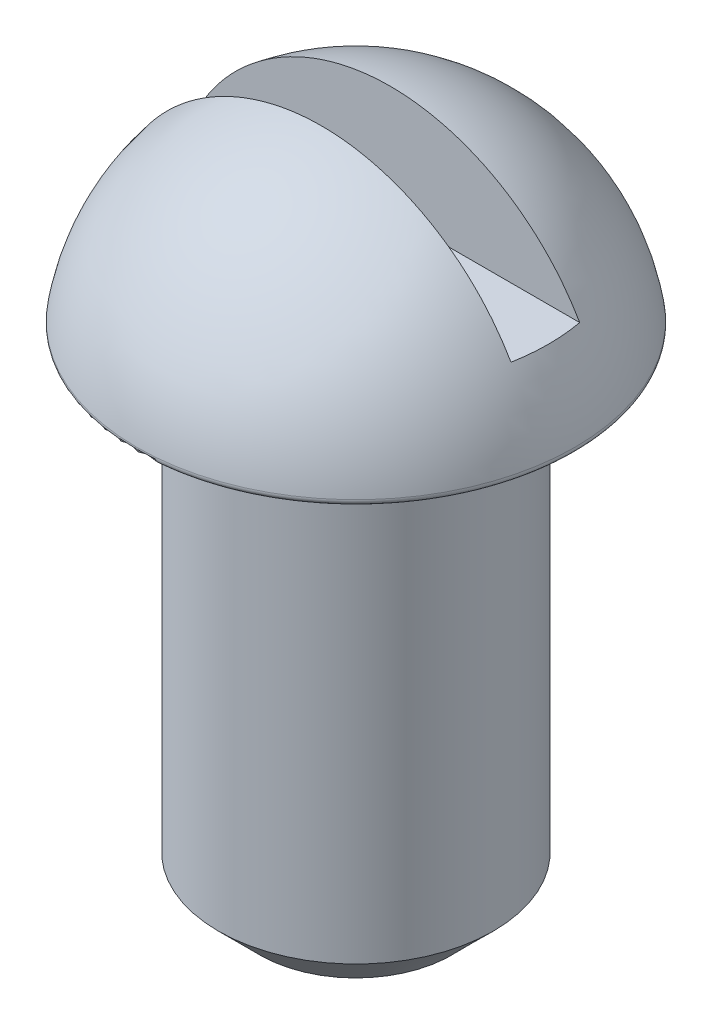
ISO-10303-21;
HEADER;
FILE_DESCRIPTION(('STEP AP214'),'2;1');
FILE_NAME('part.step','',(''),(''),'','','');
FILE_SCHEMA(('AUTOMOTIVE_DESIGN { 1 0 10303 214 1 1 1 1 }'));
ENDSEC;
DATA;
#1=APPLICATION_CONTEXT('core data for automotive mechanical design processes');
#2=APPLICATION_PROTOCOL_DEFINITION('international standard','automotive_design',2000,#1);
#3=PRODUCT_CONTEXT('',#1,'mechanical');
#4=PRODUCT('Part','Part','',(#3));
#5=PRODUCT_RELATED_PRODUCT_CATEGORY('part','',(#4));
#6=PRODUCT_DEFINITION_FORMATION('','',#4);
#7=PRODUCT_DEFINITION_CONTEXT('part definition',#1,'design');
#8=PRODUCT_DEFINITION('design','',#6,#7);
#9=PRODUCT_DEFINITION_SHAPE('','',#8);
#10=(LENGTH_UNIT() NAMED_UNIT(*) SI_UNIT(.MILLI.,.METRE.));
#11=(NAMED_UNIT(*) PLANE_ANGLE_UNIT() SI_UNIT($,.RADIAN.));
#12=(NAMED_UNIT(*) SI_UNIT($,.STERADIAN.) SOLID_ANGLE_UNIT());
#13=UNCERTAINTY_MEASURE_WITH_UNIT(LENGTH_MEASURE(1.E-05),#10,'distance_accuracy_value','');
#14=(GEOMETRIC_REPRESENTATION_CONTEXT(3) GLOBAL_UNCERTAINTY_ASSIGNED_CONTEXT((#13)) GLOBAL_UNIT_ASSIGNED_CONTEXT((#10,
#11,#12)) REPRESENTATION_CONTEXT('',''));
#15=CARTESIAN_POINT('',(0.,0.,0.));
#16=DIRECTION('',(0.,0.,1.));
#17=DIRECTION('',(1.,0.,0.));
#18=AXIS2_PLACEMENT_3D('',#15,#16,#17);
#19=CARTESIAN_POINT('',(0.,86.2524408793204,0.));
#20=DIRECTION('',(0.,1.,0.));
#21=DIRECTION('',(-1.,0.,0.));
#22=AXIS2_PLACEMENT_3D('',#19,#20,#21);
#23=DEGENERATE_TOROIDAL_SURFACE('',#22,0.0384230851507465,8.1,.F.);
#24=CARTESIAN_POINT('',(0.,87.4796137035631,0.));
#25=DIRECTION('',(0.,-1.,0.));
#26=DIRECTION('',(1.,0.,0.));
#27=AXIS2_PLACEMENT_3D('',#24,#25,#26);
#28=CIRCLE('',#27,7.96807720270539);
#29=CARTESIAN_POINT('',(7.96807720270538,87.4796137035631,0.));
#30=VERTEX_POINT('',#29);
#31=EDGE_CURVE('E109',#30,#30,#28,.F.);
#32=ORIENTED_EDGE('',*,*,#31,.T.);
#33=EDGE_LOOP('',(#32));
#34=FACE_BOUND('',#33,.T.);
#35=CARTESIAN_POINT('',(0.,90.2493131400015,0.));
#36=DIRECTION('',(0.,1.,0.));
#37=DIRECTION('',(0.,0.,1.));
#38=AXIS2_PLACEMENT_3D('',#35,#36,#37);
#39=CIRCLE('',#38,7.00678891533569);
#40=CARTESIAN_POINT('',(6.89438836330468,90.2493131400015,1.25));
#41=VERTEX_POINT('',#40);
#42=CARTESIAN_POINT('',(6.89438836330468,90.2493131400015,-1.25));
#43=VERTEX_POINT('',#42);
#44=EDGE_CURVE('E59',#41,#43,#39,.T.);
#45=ORIENTED_EDGE('',*,*,#44,.F.);
#46=CARTESIAN_POINT('',(0.,94.2493131400015,1.25));
#47=CARTESIAN_POINT('',(-0.210444098656722,94.2493106182386,1.25));
#48=CARTESIAN_POINT('',(-0.420915171091449,94.240729268692,1.25));
#49=CARTESIAN_POINT('',(-0.840711628661708,94.2066117558092,1.25));
#50=CARTESIAN_POINT('',(-1.05003533347624,94.1810552342553,1.25));
#51=CARTESIAN_POINT('',(-1.46838598501902,94.1129450587525,1.25));
#52=CARTESIAN_POINT('',(-1.67738151830488,94.0701983004619,1.25));
#53=CARTESIAN_POINT('',(-2.091338821844,93.9680592621398,1.25));
#54=CARTESIAN_POINT('',(-2.2962991585412,93.9086611767682,1.25));
#55=CARTESIAN_POINT('',(-2.70102600559802,93.7735733583917,1.25));
#56=CARTESIAN_POINT('',(-2.90078665327301,93.6978660587258,1.25));
#57=CARTESIAN_POINT('',(-3.29361013679777,93.5307006837288,1.25));
#58=CARTESIAN_POINT('',(-3.48667273310611,93.4392420457811,1.25));
#59=CARTESIAN_POINT('',(-3.87430783636395,93.2362211726433,1.25));
#60=CARTESIAN_POINT('',(-4.06847468654234,93.1238833318637,1.25));
#61=CARTESIAN_POINT('',(-4.44669740779608,92.8832939361654,1.25));
#62=CARTESIAN_POINT('',(-4.63075269267263,92.7550414600275,1.25));
#63=CARTESIAN_POINT('',(-4.98738216349701,92.483583788595,1.25));
#64=CARTESIAN_POINT('',(-5.15996041210719,92.3403839310228,1.25));
#65=CARTESIAN_POINT('',(-5.49254812705547,92.0399542364659,1.25));
#66=CARTESIAN_POINT('',(-5.65255319736907,91.8827195330858,1.25));
#67=CARTESIAN_POINT('',(-5.95929728446561,91.5548415716412,1.25));
#68=CARTESIAN_POINT('',(-6.10599153988455,91.3841564341133,1.25));
#69=CARTESIAN_POINT('',(-6.3844875052174,91.0310362248629,1.25));
#70=CARTESIAN_POINT('',(-6.5162889607459,90.8486009525186,1.25));
#71=CARTESIAN_POINT('',(-6.76406381176498,90.4732749600586,1.25));
#72=CARTESIAN_POINT('',(-6.88003683344512,90.2803839931674,1.25));
#73=CARTESIAN_POINT('',(-7.09532998959396,89.8855168764467,1.25));
#74=CARTESIAN_POINT('',(-7.19464976203485,89.6835405292297,1.25));
#75=CARTESIAN_POINT('',(-7.37594240896028,89.2719091315828,1.25));
#76=CARTESIAN_POINT('',(-7.45791254895252,89.0622528768146,1.25));
#77=CARTESIAN_POINT('',(-7.60392924760568,88.6367077733086,1.25));
#78=CARTESIAN_POINT('',(-7.66796958518981,88.4208167899068,1.25));
#79=CARTESIAN_POINT('',(-7.77761357362298,87.9844871567926,1.25));
#80=CARTESIAN_POINT('',(-7.82322397850264,87.7640502042285,1.25));
#81=CARTESIAN_POINT('',(-7.89573137564736,87.3200349746625,1.25));
#82=CARTESIAN_POINT('',(-7.9226213571892,87.0964555527616,1.25));
#83=CARTESIAN_POINT('',(-7.95746335520514,86.6479007762343,1.25));
#84=CARTESIAN_POINT('',(-7.96542165942047,86.4229259099708,1.25));
#85=CARTESIAN_POINT('',(-7.9623614586539,85.9730031967501,1.25));
#86=CARTESIAN_POINT('',(-7.95133435207463,85.7480554082418,1.25));
#87=CARTESIAN_POINT('',(-7.91036515995159,85.2998886293765,1.25));
#88=CARTESIAN_POINT('',(-7.88042304824941,85.0766696414109,1.25));
#89=CARTESIAN_POINT('',(-7.80185456534035,84.6336489099564,1.25));
#90=CARTESIAN_POINT('',(-7.75323666351383,84.4138456643884,1.25));
#91=CARTESIAN_POINT('',(-7.63763651265463,83.97902255656,1.25));
#92=CARTESIAN_POINT('',(-7.57064648272357,83.7640047628254,1.25));
#93=CARTESIAN_POINT('',(-7.41881578976161,83.3404577578911,1.25));
#94=CARTESIAN_POINT('',(-7.33398181540455,83.131926148918,1.25));
#95=CARTESIAN_POINT('',(-7.14701692699296,82.7226752987604,1.25));
#96=CARTESIAN_POINT('',(-7.04487976255134,82.5219589129854,1.25));
#97=CARTESIAN_POINT('',(-6.82409429192031,82.1299142078533,1.25));
#98=CARTESIAN_POINT('',(-6.70545171799182,81.9385826602503,1.25));
#99=CARTESIAN_POINT('',(-6.45245129030857,81.5665637752387,1.25));
#100=CARTESIAN_POINT('',(-6.31809094134135,81.3858781347431,1.25));
#101=CARTESIAN_POINT('',(-6.03462822591123,81.0364734599988,1.25));
#102=CARTESIAN_POINT('',(-5.88552620568006,80.8677541448614,1.25));
#103=CARTESIAN_POINT('',(-5.57363666143652,80.5434776445529,1.25));
#104=CARTESIAN_POINT('',(-5.41084911374973,80.3879204821517,1.25));
#105=CARTESIAN_POINT('',(-5.07274806615496,80.0910785088807,1.25));
#106=CARTESIAN_POINT('',(-4.89743476617534,79.9497934702949,1.25));
#107=CARTESIAN_POINT('',(-4.53552535871413,79.6824998839393,1.25));
#108=CARTESIAN_POINT('',(-4.34892925198677,79.5564913351483,1.25));
#109=CARTESIAN_POINT('',(-3.96585072727751,79.320694471951,1.25));
#110=CARTESIAN_POINT('',(-3.76937199528264,79.2109001692757,1.25));
#111=CARTESIAN_POINT('',(-3.36779807961204,79.0082326722168,1.25));
#112=CARTESIAN_POINT('',(-3.16270030514745,78.915364611096,1.25));
#113=CARTESIAN_POINT('',(-2.74539796181873,78.7472635302768,1.25));
#114=CARTESIAN_POINT('',(-2.53319332377721,78.6720306822947,1.25));
#115=CARTESIAN_POINT('',(-2.10330425640095,78.5398002888788,1.25));
#116=CARTESIAN_POINT('',(-1.88562292632754,78.4827926694883,1.25));
#117=CARTESIAN_POINT('',(-1.44621095139965,78.3874232061252,1.25));
#118=CARTESIAN_POINT('',(-1.22448030633082,78.3490613631395,1.25));
#119=CARTESIAN_POINT('',(-0.77860911646337,78.2914144778121,1.25));
#120=CARTESIAN_POINT('',(-0.554469267185752,78.2721240716702,1.25));
#121=CARTESIAN_POINT('',(-0.105365601560897,78.2530416668801,1.25));
#122=CARTESIAN_POINT('',(0.11959817217636,78.2532486737558,1.25));
#123=CARTESIAN_POINT('',(0.565152365889479,78.2729961666142,1.25));
#124=CARTESIAN_POINT('',(0.785756296430835,78.2922352446033,1.25));
#125=CARTESIAN_POINT('',(1.22457187068004,78.3491782117958,1.25));
#126=CARTESIAN_POINT('',(1.44278340793636,78.3868829192612,1.25));
#127=CARTESIAN_POINT('',(1.87535784169964,78.4803674664853,1.25));
#128=CARTESIAN_POINT('',(2.08971970399034,78.5361520889635,1.25));
#129=CARTESIAN_POINT('',(2.51305776453362,78.6653473749476,1.25));
#130=CARTESIAN_POINT('',(2.72203407918857,78.738757657141,1.25));
#131=CARTESIAN_POINT('',(3.13444748787196,78.9031821267064,1.25));
#132=CARTESIAN_POINT('',(3.33784216472272,78.9943027204864,1.25));
#133=CARTESIAN_POINT('',(3.73638797719893,79.1932394886285,1.25));
#134=CARTESIAN_POINT('',(3.93153607799668,79.3010617424352,1.25));
#135=CARTESIAN_POINT('',(4.31209095748389,79.5325821369262,1.25));
#136=CARTESIAN_POINT('',(4.49750081061984,79.6562752240768,1.25));
#137=CARTESIAN_POINT('',(4.85735822364165,79.9187000701622,1.25));
#138=CARTESIAN_POINT('',(5.03180556856822,80.0574321238446,1.25));
#139=CARTESIAN_POINT('',(5.37009685679253,80.3503298436769,1.25));
#140=CARTESIAN_POINT('',(5.53382629585807,80.5046277893097,1.25));
#141=CARTESIAN_POINT('',(5.84771839692947,80.82646423541,1.25));
#142=CARTESIAN_POINT('',(5.99788064881993,80.9940031358445,1.25));
#143=CARTESIAN_POINT('',(6.28355229639746,81.3411083521698,1.25));
#144=CARTESIAN_POINT('',(6.41906330902858,81.5206733372851,1.25));
#145=CARTESIAN_POINT('',(6.67453448042463,81.8906363464321,1.25));
#146=CARTESIAN_POINT('',(6.79448923255118,82.0810381039202,1.25));
#147=CARTESIAN_POINT('',(7.01799002173021,82.4713504989884,1.25));
#148=CARTESIAN_POINT('',(7.12152889004197,82.6712652415711,1.25));
#149=CARTESIAN_POINT('',(7.31140127780168,83.0791099269327,1.25));
#150=CARTESIAN_POINT('',(7.3977344320573,83.2870400397264,1.25));
#151=CARTESIAN_POINT('',(7.55257614074594,83.7094248808696,1.25));
#152=CARTESIAN_POINT('',(7.62108541510871,83.9238793453012,1.25));
#153=CARTESIAN_POINT('',(7.73979845302628,84.3578011838744,1.25));
#154=CARTESIAN_POINT('',(7.79000183467621,84.5772686624981,1.25));
#155=CARTESIAN_POINT('',(7.87174930331176,85.0196788939339,1.25));
#156=CARTESIAN_POINT('',(7.90329115187189,85.2426220603596,1.25));
#157=CARTESIAN_POINT('',(7.94748201617815,85.6903730279526,1.25));
#158=CARTESIAN_POINT('',(7.96013103083353,85.9151808292275,1.25));
#159=CARTESIAN_POINT('',(7.96644637679804,86.3650659363584,1.25));
#160=CARTESIAN_POINT('',(7.96011245290761,86.5901432457969,1.25));
#161=CARTESIAN_POINT('',(7.92850671479288,87.0389595281643,1.25));
#162=CARTESIAN_POINT('',(7.90323529670291,87.2626985289894,1.25));
#163=CARTESIAN_POINT('',(7.83393339785661,87.7072602336917,1.25));
#164=CARTESIAN_POINT('',(7.78990225801202,87.9280828348256,1.25));
#165=CARTESIAN_POINT('',(7.68339486759447,88.3652291543189,1.25));
#166=CARTESIAN_POINT('',(7.62091900323181,88.5815529667762,1.25));
#167=CARTESIAN_POINT('',(7.47795104139983,89.0082125545328,1.25));
#168=CARTESIAN_POINT('',(7.39745523499733,89.2185470870354,1.25));
#169=CARTESIAN_POINT('',(7.21905792222326,89.63161395899,1.25));
#170=CARTESIAN_POINT('',(7.12116244956357,89.8343489043475,1.25));
#171=CARTESIAN_POINT('',(6.90861869156009,90.2308965965202,1.25));
#172=CARTESIAN_POINT('',(6.79396667170471,90.424707341714,1.25));
#173=CARTESIAN_POINT('',(6.54874374531734,90.8019755597794,1.25));
#174=CARTESIAN_POINT('',(6.41817319796679,90.9854332661176,1.25));
#175=CARTESIAN_POINT('',(6.14205529080358,91.3406743143524,1.25));
#176=CARTESIAN_POINT('',(5.99650968592206,91.5124590203021,1.25));
#177=CARTESIAN_POINT('',(5.69146550963913,91.8431529093948,1.25));
#178=CARTESIAN_POINT('',(5.5319671591376,92.0020622963031,1.25));
#179=CARTESIAN_POINT('',(5.2001752283745,92.3058531902102,1.25));
#180=CARTESIAN_POINT('',(5.02788370173973,92.4507369401115,1.25));
#181=CARTESIAN_POINT('',(4.67176970393338,92.7254247896594,1.25));
#182=CARTESIAN_POINT('',(4.48795134092709,92.8552342152839,1.25));
#183=CARTESIAN_POINT('',(4.10987479186606,93.0990093186926,1.25));
#184=CARTESIAN_POINT('',(3.91560800236621,93.2129616536865,1.25));
#185=CARTESIAN_POINT('',(3.51816281074762,93.4240732954152,1.25));
#186=CARTESIAN_POINT('',(3.31498471162153,93.5212331725547,1.25));
#187=CARTESIAN_POINT('',(2.90108517487601,93.6980917154391,1.25));
#188=CARTESIAN_POINT('',(2.69036122924992,93.777784511807,1.25));
#189=CARTESIAN_POINT('',(2.26282726627416,93.9191109728184,1.25));
#190=CARTESIAN_POINT('',(2.04601437792325,93.9807359561495,1.25));
#191=CARTESIAN_POINT('',(1.60853242770438,94.0852466143989,1.25));
#192=CARTESIAN_POINT('',(1.38787516911976,94.1281817431351,1.25));
#193=CARTESIAN_POINT('',(0.943714589317433,94.1951191151988,1.25));
#194=CARTESIAN_POINT('',(0.720211688949784,94.2191241258518,1.25));
#195=CARTESIAN_POINT('',(0.330966567629653,94.2440118485027,1.25));
#196=CARTESIAN_POINT('',(0.16549162428084,94.2493151230965,1.25));
#197=CARTESIAN_POINT('',(0.,94.2493131400015,1.25));
#198=B_SPLINE_CURVE_WITH_KNOTS('',3,(#46,#47,#48,#49,#50,#51,#52,#53,#54,#55,#56,#57,#58,#59,
#60,#61,#62,#63,#64,#65,#66,#67,#68,#69,#70,#71,#72,#73,#74,#75,#76,#77,#78,#79,#80,#81,#82,#83,
#84,#85,#86,#87,#88,#89,#90,#91,#92,#93,#94,#95,#96,#97,#98,#99,#100,#101,#102,#103,#104,#105,
#106,#107,#108,#109,#110,#111,#112,#113,#114,#115,#116,#117,#118,#119,#120,#121,#122,#123,#124,
#125,#126,#127,#128,#129,#130,#131,#132,#133,#134,#135,#136,#137,#138,#139,#140,#141,#142,#143,
#144,#145,#146,#147,#148,#149,#150,#151,#152,#153,#154,#155,#156,#157,#158,#159,#160,#161,#162,
#163,#164,#165,#166,#167,#168,#169,#170,#171,#172,#173,#174,#175,#176,#177,#178,#179,#180,#181,
#182,#183,#184,#185,#186,#187,#188,#189,#190,#191,#192,#193,#194,#195,#196,#197),.UNSPECIFIED.,
.T.,.F.,(4,2,2,2,2,2,2,2,2,2,2,2,2,2,2,2,2,2,2,2,2,2,2,2,2,2,2,2,2,2,2,2,2,2,2,2,2,2,2,2,2,2,2,
2,2,2,2,2,2,2,2,2,2,2,2,2,2,2,2,2,2,2,2,2,2,2,2,2,2,2,2,2,2,2,2,4),(0.,0.631208043547601,
1.26317446108228,1.90244767005342,2.54194403384294,3.18213267443147,3.82234418644087,
4.49451211221917,5.16671896462544,5.83868658734584,6.51088811773095,7.18527226549462,
7.85966793074069,8.53407952002158,9.20850576855008,9.88303823502589,10.5578044537999,
11.2323231657542,11.9070943465667,12.5816413856284,13.2564941177848,13.9313477832273,
14.6058957664175,15.2807298741197,15.9553114744829,16.6301372738508,17.3047292913542,
17.9794285467151,18.6541119594473,19.3287965393289,20.0034703527149,20.6781441210009,
21.3525680912731,22.0271962566463,22.7018309906824,23.3760921744601,24.0503533939316,
24.7244249249079,25.3984620745172,26.0619927714212,26.7255528738229,27.3892886526951,
28.0530100736365,28.7208499106751,29.3889334167739,30.0568047196059,30.7246891143665,
31.3988236131078,32.0729784830945,32.7470588757091,33.4213729232572,34.0959806343554,
34.770602662519,35.4451974375867,36.1198062855156,36.7944960354607,37.4691858243583,
38.1438846835749,38.818569429841,39.4932778818677,40.1679722073148,40.8428055288076,
41.5174052921529,42.1921556326564,42.8668907510889,43.5415468869951,44.2161923436765,
44.8907297359343,45.5650280745238,46.2398904075581,46.9147298124195,47.5897956337708,
48.2651852845133,48.9387768107119,49.6122698487388,50.1086470104298),.UNSPECIFIED.);
#199=CARTESIAN_POINT('',(-6.89438836330469,90.2493131400015,1.25));
#200=VERTEX_POINT('',#199);
#201=EDGE_CURVE('E57',#41,#200,#198,.T.);
#202=ORIENTED_EDGE('',*,*,#201,.T.);
#203=CARTESIAN_POINT('',(-6.89438836330469,90.2493131400015,-1.25));
#204=VERTEX_POINT('',#203);
#205=EDGE_CURVE('E58',#204,#200,#39,.T.);
#206=ORIENTED_EDGE('',*,*,#205,.F.);
#207=CARTESIAN_POINT('',(0.,94.2493131400015,-1.25));
#208=CARTESIAN_POINT('',(0.210444098656708,94.2493106182386,-1.25));
#209=CARTESIAN_POINT('',(0.420915171091435,94.240729268692,-1.25));
#210=CARTESIAN_POINT('',(0.840711628661694,94.2066117558092,-1.25));
#211=CARTESIAN_POINT('',(1.05003533347623,94.1810552342553,-1.25));
#212=CARTESIAN_POINT('',(1.46838598501901,94.1129450587525,-1.25));
#213=CARTESIAN_POINT('',(1.67738151830487,94.0701983004619,-1.25));
#214=CARTESIAN_POINT('',(2.09133882184399,93.9680592621398,-1.25));
#215=CARTESIAN_POINT('',(2.29629915854119,93.9086611767682,-1.25));
#216=CARTESIAN_POINT('',(2.70102600559801,93.7735733583917,-1.25));
#217=CARTESIAN_POINT('',(2.900786653273,93.6978660587258,-1.25));
#218=CARTESIAN_POINT('',(3.29361013679776,93.5307006837288,-1.25));
#219=CARTESIAN_POINT('',(3.4866727331061,93.4392420457811,-1.25));
#220=CARTESIAN_POINT('',(3.87430783636394,93.2362211726433,-1.25));
#221=CARTESIAN_POINT('',(4.06847468654233,93.1238833318637,-1.25));
#222=CARTESIAN_POINT('',(4.44669740779607,92.8832939361654,-1.25));
#223=CARTESIAN_POINT('',(4.63075269267261,92.7550414600275,-1.25));
#224=CARTESIAN_POINT('',(4.987382163497,92.483583788595,-1.25));
#225=CARTESIAN_POINT('',(5.15996041210717,92.3403839310228,-1.25));
#226=CARTESIAN_POINT('',(5.49254812705545,92.0399542364659,-1.25));
#227=CARTESIAN_POINT('',(5.65255319736905,91.8827195330858,-1.25));
#228=CARTESIAN_POINT('',(5.9592972844656,91.5548415716412,-1.25));
#229=CARTESIAN_POINT('',(6.10599153988453,91.3841564341133,-1.25));
#230=CARTESIAN_POINT('',(6.38448750521737,91.0310362248629,-1.25));
#231=CARTESIAN_POINT('',(6.51628896074588,90.8486009525186,-1.25));
#232=CARTESIAN_POINT('',(6.76406381176496,90.4732749600586,-1.25));
#233=CARTESIAN_POINT('',(6.88003683344509,90.2803839931674,-1.25));
#234=CARTESIAN_POINT('',(7.09532998959394,89.8855168764467,-1.25));
#235=CARTESIAN_POINT('',(7.19464976203483,89.6835405292297,-1.25));
#236=CARTESIAN_POINT('',(7.37594240896026,89.2719091315828,-1.25));
#237=CARTESIAN_POINT('',(7.45791254895251,89.0622528768147,-1.25));
#238=CARTESIAN_POINT('',(7.60392924760567,88.6367077733086,-1.25));
#239=CARTESIAN_POINT('',(7.6679695851898,88.4208167899068,-1.25));
#240=CARTESIAN_POINT('',(7.77761357362296,87.9844871567926,-1.25));
#241=CARTESIAN_POINT('',(7.82322397850263,87.7640502042285,-1.25));
#242=CARTESIAN_POINT('',(7.89573137564735,87.3200349746625,-1.25));
#243=CARTESIAN_POINT('',(7.92262135718919,87.0964555527616,-1.25));
#244=CARTESIAN_POINT('',(7.95746335520512,86.6479007762343,-1.25));
#245=CARTESIAN_POINT('',(7.96542165942045,86.4229259099708,-1.25));
#246=CARTESIAN_POINT('',(7.96236145865389,85.9730031967501,-1.25));
#247=CARTESIAN_POINT('',(7.95133435207461,85.7480554082418,-1.25));
#248=CARTESIAN_POINT('',(7.91036515995157,85.2998886293765,-1.25));
#249=CARTESIAN_POINT('',(7.8804230482494,85.0766696414109,-1.25));
#250=CARTESIAN_POINT('',(7.80185456534034,84.6336489099564,-1.25));
#251=CARTESIAN_POINT('',(7.75323666351381,84.4138456643884,-1.25));
#252=CARTESIAN_POINT('',(7.63763651265462,83.97902255656,-1.25));
#253=CARTESIAN_POINT('',(7.57064648272356,83.7640047628254,-1.25));
#254=CARTESIAN_POINT('',(7.4188157897616,83.3404577578911,-1.25));
#255=CARTESIAN_POINT('',(7.33398181540454,83.131926148918,-1.25));
#256=CARTESIAN_POINT('',(7.14701692699294,82.7226752987604,-1.25));
#257=CARTESIAN_POINT('',(7.04487976255133,82.5219589129854,-1.25));
#258=CARTESIAN_POINT('',(6.8240942919203,82.1299142078533,-1.25));
#259=CARTESIAN_POINT('',(6.70545171799181,81.9385826602503,-1.25));
#260=CARTESIAN_POINT('',(6.45245129030856,81.5665637752387,-1.25));
#261=CARTESIAN_POINT('',(6.31809094134133,81.3858781347431,-1.25));
#262=CARTESIAN_POINT('',(6.03462822591121,81.0364734599988,-1.25));
#263=CARTESIAN_POINT('',(5.88552620568005,80.8677541448614,-1.25));
#264=CARTESIAN_POINT('',(5.57363666143651,80.5434776445529,-1.25));
#265=CARTESIAN_POINT('',(5.41084911374972,80.3879204821517,-1.25));
#266=CARTESIAN_POINT('',(5.07274806615495,80.0910785088807,-1.25));
#267=CARTESIAN_POINT('',(4.89743476617533,79.9497934702949,-1.25));
#268=CARTESIAN_POINT('',(4.53552535871412,79.6824998839393,-1.25));
#269=CARTESIAN_POINT('',(4.34892925198676,79.5564913351483,-1.25));
#270=CARTESIAN_POINT('',(3.96585072727749,79.320694471951,-1.25));
#271=CARTESIAN_POINT('',(3.76937199528262,79.2109001692757,-1.25));
#272=CARTESIAN_POINT('',(3.36779807961202,79.0082326722168,-1.25));
#273=CARTESIAN_POINT('',(3.16270030514742,78.915364611096,-1.25));
#274=CARTESIAN_POINT('',(2.74539796181871,78.7472635302768,-1.25));
#275=CARTESIAN_POINT('',(2.5331933237772,78.6720306822947,-1.25));
#276=CARTESIAN_POINT('',(2.10330425640094,78.5398002888788,-1.25));
#277=CARTESIAN_POINT('',(1.88562292632752,78.4827926694883,-1.25));
#278=CARTESIAN_POINT('',(1.44621095139964,78.3874232061252,-1.25));
#279=CARTESIAN_POINT('',(1.2244803063308,78.3490613631395,-1.25));
#280=CARTESIAN_POINT('',(0.778609116463357,78.2914144778121,-1.25));
#281=CARTESIAN_POINT('',(0.554469267185739,78.2721240716702,-1.25));
#282=CARTESIAN_POINT('',(0.105365601560883,78.2530416668801,-1.25));
#283=CARTESIAN_POINT('',(-0.119598172176373,78.2532486737558,-1.25));
#284=CARTESIAN_POINT('',(-0.565152365889492,78.2729961666142,-1.25));
#285=CARTESIAN_POINT('',(-0.785756296430847,78.2922352446033,-1.25));
#286=CARTESIAN_POINT('',(-1.22457187068006,78.3491782117958,-1.25));
#287=CARTESIAN_POINT('',(-1.44278340793637,78.3868829192612,-1.25));
#288=CARTESIAN_POINT('',(-1.87535784169965,78.4803674664853,-1.25));
#289=CARTESIAN_POINT('',(-2.08971970399035,78.5361520889635,-1.25));
#290=CARTESIAN_POINT('',(-2.51305776453363,78.6653473749476,-1.25));
#291=CARTESIAN_POINT('',(-2.72203407918858,78.738757657141,-1.25));
#292=CARTESIAN_POINT('',(-3.13444748787197,78.9031821267064,-1.25));
#293=CARTESIAN_POINT('',(-3.33784216472273,78.9943027204864,-1.25));
#294=CARTESIAN_POINT('',(-3.73638797719894,79.1932394886285,-1.25));
#295=CARTESIAN_POINT('',(-3.93153607799669,79.3010617424352,-1.25));
#296=CARTESIAN_POINT('',(-4.3120909574839,79.5325821369262,-1.25));
#297=CARTESIAN_POINT('',(-4.49750081061986,79.6562752240768,-1.25));
#298=CARTESIAN_POINT('',(-4.85735822364166,79.9187000701622,-1.25));
#299=CARTESIAN_POINT('',(-5.03180556856823,80.0574321238446,-1.25));
#300=CARTESIAN_POINT('',(-5.37009685679254,80.3503298436769,-1.25));
#301=CARTESIAN_POINT('',(-5.53382629585808,80.5046277893097,-1.25));
#302=CARTESIAN_POINT('',(-5.84771839692948,80.82646423541,-1.25));
#303=CARTESIAN_POINT('',(-5.99788064881994,80.9940031358445,-1.25));
#304=CARTESIAN_POINT('',(-6.28355229639747,81.3411083521698,-1.25));
#305=CARTESIAN_POINT('',(-6.41906330902858,81.5206733372851,-1.25));
#306=CARTESIAN_POINT('',(-6.67453448042464,81.890636346432,-1.25));
#307=CARTESIAN_POINT('',(-6.79448923255118,82.0810381039202,-1.25));
#308=CARTESIAN_POINT('',(-7.01799002173022,82.4713504989883,-1.25));
#309=CARTESIAN_POINT('',(-7.12152889004197,82.6712652415711,-1.25));
#310=CARTESIAN_POINT('',(-7.31140127780169,83.0791099269326,-1.25));
#311=CARTESIAN_POINT('',(-7.39773443205731,83.2870400397264,-1.25));
#312=CARTESIAN_POINT('',(-7.55257614074594,83.7094248808696,-1.25));
#313=CARTESIAN_POINT('',(-7.62108541510872,83.9238793453011,-1.25));
#314=CARTESIAN_POINT('',(-7.73979845302629,84.3578011838743,-1.25));
#315=CARTESIAN_POINT('',(-7.79000183467622,84.5772686624981,-1.25));
#316=CARTESIAN_POINT('',(-7.87174930331177,85.0196788939339,-1.25));
#317=CARTESIAN_POINT('',(-7.9032911518719,85.2426220603596,-1.25));
#318=CARTESIAN_POINT('',(-7.94748201617817,85.6903730279526,-1.25));
#319=CARTESIAN_POINT('',(-7.96013103083354,85.9151808292275,-1.25));
#320=CARTESIAN_POINT('',(-7.96644637679805,86.3650659363584,-1.25));
#321=CARTESIAN_POINT('',(-7.96011245290762,86.5901432457969,-1.25));
#322=CARTESIAN_POINT('',(-7.92850671479289,87.0389595281644,-1.25));
#323=CARTESIAN_POINT('',(-7.90323529670292,87.2626985289894,-1.25));
#324=CARTESIAN_POINT('',(-7.83393339785663,87.7072602336917,-1.25));
#325=CARTESIAN_POINT('',(-7.78990225801203,87.9280828348255,-1.25));
#326=CARTESIAN_POINT('',(-7.68339486759449,88.3652291543189,-1.25));
#327=CARTESIAN_POINT('',(-7.62091900323183,88.5815529667761,-1.25));
#328=CARTESIAN_POINT('',(-7.47795104139985,89.0082125545328,-1.25));
#329=CARTESIAN_POINT('',(-7.39745523499735,89.2185470870354,-1.25));
#330=CARTESIAN_POINT('',(-7.21905792222328,89.6316139589899,-1.25));
#331=CARTESIAN_POINT('',(-7.1211624495636,89.8343489043475,-1.25));
#332=CARTESIAN_POINT('',(-6.90861869156011,90.2308965965202,-1.25));
#333=CARTESIAN_POINT('',(-6.79396667170472,90.424707341714,-1.25));
#334=CARTESIAN_POINT('',(-6.54874374531735,90.8019755597794,-1.25));
#335=CARTESIAN_POINT('',(-6.41817319796681,90.9854332661176,-1.25));
#336=CARTESIAN_POINT('',(-6.14205529080361,91.3406743143523,-1.25));
#337=CARTESIAN_POINT('',(-5.99650968592208,91.5124590203021,-1.25));
#338=CARTESIAN_POINT('',(-5.69146550963914,91.8431529093948,-1.25));
#339=CARTESIAN_POINT('',(-5.53196715913762,92.0020622963031,-1.25));
#340=CARTESIAN_POINT('',(-5.20017522837451,92.3058531902102,-1.25));
#341=CARTESIAN_POINT('',(-5.02788370173974,92.4507369401115,-1.25));
#342=CARTESIAN_POINT('',(-4.6717697039334,92.7254247896594,-1.25));
#343=CARTESIAN_POINT('',(-4.4879513409271,92.8552342152839,-1.25));
#344=CARTESIAN_POINT('',(-4.10987479186607,93.0990093186926,-1.25));
#345=CARTESIAN_POINT('',(-3.91560800236622,93.2129616536865,-1.25));
#346=CARTESIAN_POINT('',(-3.51816281074763,93.4240732954152,-1.25));
#347=CARTESIAN_POINT('',(-3.31498471162154,93.5212331725547,-1.25));
#348=CARTESIAN_POINT('',(-2.90108517487602,93.6980917154391,-1.25));
#349=CARTESIAN_POINT('',(-2.69036122924993,93.777784511807,-1.25));
#350=CARTESIAN_POINT('',(-2.26282726627417,93.9191109728184,-1.25));
#351=CARTESIAN_POINT('',(-2.04601437792326,93.9807359561495,-1.25));
#352=CARTESIAN_POINT('',(-1.60853242770439,94.0852466143989,-1.25));
#353=CARTESIAN_POINT('',(-1.38787516911978,94.1281817431351,-1.25));
#354=CARTESIAN_POINT('',(-0.94371458931745,94.1951191151988,-1.25));
#355=CARTESIAN_POINT('',(-0.7202116889498,94.2191241258518,-1.25));
#356=CARTESIAN_POINT('',(-0.330966567629668,94.2440118485027,-1.25));
#357=CARTESIAN_POINT('',(-0.165491624280855,94.2493151230965,-1.25));
#358=CARTESIAN_POINT('',(0.,94.2493131400015,-1.25));
#359=B_SPLINE_CURVE_WITH_KNOTS('',3,(#207,#208,#209,#210,#211,#212,#213,#214,#215,#216,#217,
#218,#219,#220,#221,#222,#223,#224,#225,#226,#227,#228,#229,#230,#231,#232,#233,#234,#235,#236,
#237,#238,#239,#240,#241,#242,#243,#244,#245,#246,#247,#248,#249,#250,#251,#252,#253,#254,#255,
#256,#257,#258,#259,#260,#261,#262,#263,#264,#265,#266,#267,#268,#269,#270,#271,#272,#273,#274,
#275,#276,#277,#278,#279,#280,#281,#282,#283,#284,#285,#286,#287,#288,#289,#290,#291,#292,#293,
#294,#295,#296,#297,#298,#299,#300,#301,#302,#303,#304,#305,#306,#307,#308,#309,#310,#311,#312,
#313,#314,#315,#316,#317,#318,#319,#320,#321,#322,#323,#324,#325,#326,#327,#328,#329,#330,#331,
#332,#333,#334,#335,#336,#337,#338,#339,#340,#341,#342,#343,#344,#345,#346,#347,#348,#349,#350,
#351,#352,#353,#354,#355,#356,#357,#358),.UNSPECIFIED.,.T.,.F.,(4,2,2,2,2,2,2,2,2,2,2,2,2,2,2,2,
2,2,2,2,2,2,2,2,2,2,2,2,2,2,2,2,2,2,2,2,2,2,2,2,2,2,2,2,2,2,2,2,2,2,2,2,2,2,2,2,2,2,2,2,2,2,2,2,
2,2,2,2,2,2,2,2,2,2,2,4),(0.,0.631208043547601,1.26317446108228,1.90244767005342,
2.54194403384294,3.18213267443147,3.82234418644087,4.49451211221918,5.16671896462544,
5.83868658734584,6.51088811773094,7.1852722654946,7.85966793074066,8.53407952002154,
9.20850576855007,9.88303823502588,10.5578044537999,11.2323231657542,11.9070943465667,
12.5816413856284,13.2564941177848,13.9313477832273,14.6058957664175,15.2807298741197,
15.9553114744829,16.6301372738508,17.3047292913542,17.9794285467151,18.6541119594473,
19.3287965393289,20.0034703527149,20.6781441210009,21.3525680912731,22.0271962566463,
22.7018309906824,23.3760921744601,24.0503533939316,24.7244249249079,25.3984620745172,
26.0619927714212,26.7255528738229,27.3892886526951,28.0530100736365,28.7208499106751,
29.3889334167739,30.0568047196059,30.7246891143665,31.3988236131078,32.0729784830945,
32.7470588757091,33.4213729232571,34.0959806343554,34.770602662519,35.4451974375867,
36.1198062855156,36.7944960354607,37.4691858243583,38.143884683575,38.818569429841,
39.4932778818677,40.1679722073147,40.8428055288076,41.5174052921529,42.1921556326564,
42.8668907510889,43.5415468869951,44.2161923436766,44.8907297359343,45.5650280745239,
46.2398904075581,46.9147298124195,47.5897956337708,48.2651852845133,48.9387768107119,
49.6122698487388,50.1086470104298),.UNSPECIFIED.);
#360=EDGE_CURVE('E51',#204,#43,#359,.T.);
#361=ORIENTED_EDGE('',*,*,#360,.T.);
#362=EDGE_LOOP('',(#45,#202,#206,#361));
#363=FACE_BOUND('',#362,.T.);
#364=ADVANCED_FACE('F29',(#34,#363),#23,.F.);
#365=CARTESIAN_POINT('',(5.,87.2493131400015,0.));
#366=DIRECTION('',(0.,1.,0.));
#367=DIRECTION('',(-1.,0.,0.));
#368=AXIS2_PLACEMENT_3D('',#365,#366,#367);
#369=PLANE('',#368);
#370=CARTESIAN_POINT('',(0.,87.2493131400015,0.));
#371=DIRECTION('',(0.,1.,0.));
#372=DIRECTION('',(-1.,0.,0.));
#373=AXIS2_PLACEMENT_3D('',#370,#371,#372);
#374=CIRCLE('',#373,7.77038583757314);
#375=CARTESIAN_POINT('',(-7.77038583757315,87.2493131400015,0.));
#376=VERTEX_POINT('',#375);
#377=EDGE_CURVE('E104',#376,#376,#374,.F.);
#378=ORIENTED_EDGE('',*,*,#377,.T.);
#379=EDGE_LOOP('',(#378));
#380=FACE_BOUND('',#379,.T.);
#381=CARTESIAN_POINT('',(0.,87.2493131400015,0.));
#382=DIRECTION('',(0.,1.,0.));
#383=DIRECTION('',(-1.,0.,0.));
#384=AXIS2_PLACEMENT_3D('',#381,#382,#383);
#385=CIRCLE('',#384,5.00000000000001);
#386=CARTESIAN_POINT('',(-5.00000000000002,87.2493131400015,0.));
#387=VERTEX_POINT('',#386);
#388=EDGE_CURVE('E66',#387,#387,#385,.T.);
#389=ORIENTED_EDGE('',*,*,#388,.T.);
#390=EDGE_LOOP('',(#389));
#391=FACE_BOUND('',#390,.T.);
#392=ADVANCED_FACE('F92',(#380,#391),#369,.F.);
#393=CARTESIAN_POINT('',(0.,125.763182897862,0.));
#394=DIRECTION('',(0.,1.,0.));
#395=DIRECTION('',(-1.,0.,0.));
#396=AXIS2_PLACEMENT_3D('',#393,#394,#395);
#397=CYLINDRICAL_SURFACE('',#396,5.00000000000001);
#398=CARTESIAN_POINT('',(0.,70.7493131400015,0.));
#399=DIRECTION('',(0.,1.,0.));
#400=DIRECTION('',(-1.,0.,0.));
#401=AXIS2_PLACEMENT_3D('',#398,#399,#400);
#402=CIRCLE('',#401,5.00000000000001);
#403=CARTESIAN_POINT('',(-5.00000000000002,70.7493131400015,0.));
#404=VERTEX_POINT('',#403);
#405=EDGE_CURVE('E37',#404,#404,#402,.T.);
#406=ORIENTED_EDGE('',*,*,#405,.T.);
#407=EDGE_LOOP('',(#406));
#408=FACE_BOUND('',#407,.T.);
#409=ORIENTED_EDGE('',*,*,#388,.F.);
#410=EDGE_LOOP('',(#409));
#411=FACE_BOUND('',#410,.T.);
#412=ADVANCED_FACE('F89',(#408,#411),#397,.T.);
#413=CARTESIAN_POINT('',(5.00000000000001,69.2493131400015,0.));
#414=DIRECTION('',(0.,1.,0.));
#415=DIRECTION('',(-1.,0.,0.));
#416=AXIS2_PLACEMENT_3D('',#413,#414,#415);
#417=PLANE('',#416);
#418=CARTESIAN_POINT('',(0.,69.2493131400015,0.));
#419=DIRECTION('',(0.,1.,0.));
#420=DIRECTION('',(-1.,0.,0.));
#421=AXIS2_PLACEMENT_3D('',#418,#419,#420);
#422=CIRCLE('',#421,3.50000000000002);
#423=CARTESIAN_POINT('',(-3.50000000000002,69.2493131400015,0.));
#424=VERTEX_POINT('',#423);
#425=EDGE_CURVE('E11',#424,#424,#422,.F.);
#426=ORIENTED_EDGE('',*,*,#425,.T.);
#427=EDGE_LOOP('',(#426));
#428=FACE_BOUND('',#427,.T.);
#429=ADVANCED_FACE('F86',(#428),#417,.F.);
#430=CARTESIAN_POINT('',(-8.00000000000001,90.2493131400015,-1.25));
#431=DIRECTION('',(0.,1.,0.));
#432=DIRECTION('',(0.,0.,1.));
#433=AXIS2_PLACEMENT_3D('',#430,#431,#432);
#434=PLANE('',#433);
#435=ORIENTED_EDGE('',*,*,#44,.T.);
#436=DIRECTION('',(-1.,0.,0.));
#437=VECTOR('',#436,1.);
#438=CARTESIAN_POINT('',(-8.00000000000001,90.2493131400015,-1.25));
#439=LINE('',#438,#437);
#440=EDGE_CURVE('E44',#43,#204,#439,.T.);
#441=ORIENTED_EDGE('',*,*,#440,.T.);
#442=ORIENTED_EDGE('',*,*,#205,.T.);
#443=DIRECTION('',(1.,0.,0.));
#444=VECTOR('',#443,1.);
#445=CARTESIAN_POINT('',(-8.00000000000001,90.2493131400015,1.25));
#446=LINE('',#445,#444);
#447=EDGE_CURVE('E65',#200,#41,#446,.T.);
#448=ORIENTED_EDGE('',*,*,#447,.T.);
#449=EDGE_LOOP('',(#435,#441,#442,#448));
#450=FACE_BOUND('',#449,.T.);
#451=ADVANCED_FACE('F64',(#450),#434,.T.);
#452=CARTESIAN_POINT('',(-8.00000000000001,90.2493131400015,-1.25));
#453=DIRECTION('',(0.,0.,-1.));
#454=DIRECTION('',(-1.,0.,0.));
#455=AXIS2_PLACEMENT_3D('',#452,#453,#454);
#456=PLANE('',#455);
#457=ORIENTED_EDGE('',*,*,#360,.F.);
#458=ORIENTED_EDGE('',*,*,#440,.F.);
#459=EDGE_LOOP('',(#457,#458));
#460=FACE_BOUND('',#459,.T.);
#461=ADVANCED_FACE('F83',(#460),#456,.F.);
#462=CARTESIAN_POINT('',(-8.00000000000001,90.2493131400015,1.25));
#463=DIRECTION('',(0.,0.,1.));
#464=DIRECTION('',(1.,0.,0.));
#465=AXIS2_PLACEMENT_3D('',#462,#463,#464);
#466=PLANE('',#465);
#467=ORIENTED_EDGE('',*,*,#201,.F.);
#468=ORIENTED_EDGE('',*,*,#447,.F.);
#469=EDGE_LOOP('',(#467,#468));
#470=FACE_BOUND('',#469,.T.);
#471=ADVANCED_FACE('F68',(#470),#466,.F.);
#472=CARTESIAN_POINT('',(0.,87.4493131400015,0.));
#473=DIRECTION('',(0.,1.,0.));
#474=DIRECTION('',(-1.,0.,0.));
#475=AXIS2_PLACEMENT_3D('',#472,#473,#474);
#476=TOROIDAL_SURFACE('',#475,7.77038583757314,0.2);
#477=ORIENTED_EDGE('',*,*,#377,.F.);
#478=EDGE_LOOP('',(#477));
#479=FACE_BOUND('',#478,.T.);
#480=ORIENTED_EDGE('',*,*,#31,.F.);
#481=EDGE_LOOP('',(#480));
#482=FACE_BOUND('',#481,.T.);
#483=ADVANCED_FACE('F82',(#479,#482),#476,.T.);
#484=CARTESIAN_POINT('',(0.,70.7493131400015,0.));
#485=DIRECTION('',(0.,1.,0.));
#486=DIRECTION('',(-1.,0.,0.));
#487=AXIS2_PLACEMENT_3D('',#484,#485,#486);
#488=CONICAL_SURFACE('',#487,5.00000000000001,0.785398163397446);
#489=ORIENTED_EDGE('',*,*,#425,.F.);
#490=EDGE_LOOP('',(#489));
#491=FACE_BOUND('',#490,.T.);
#492=ORIENTED_EDGE('',*,*,#405,.F.);
#493=EDGE_LOOP('',(#492));
#494=FACE_BOUND('',#493,.T.);
#495=ADVANCED_FACE('F115',(#491,#494),#488,.T.);
#496=CLOSED_SHELL('',(#364,#392,#412,#429,#451,#461,#471,#483,#495));
#497=MANIFOLD_SOLID_BREP('B2',#496);
#498=ADVANCED_BREP_SHAPE_REPRESENTATION('',(#18,#497),#14);
#499=SHAPE_DEFINITION_REPRESENTATION(#9,#498);
ENDSEC;
END-ISO-10303-21;
